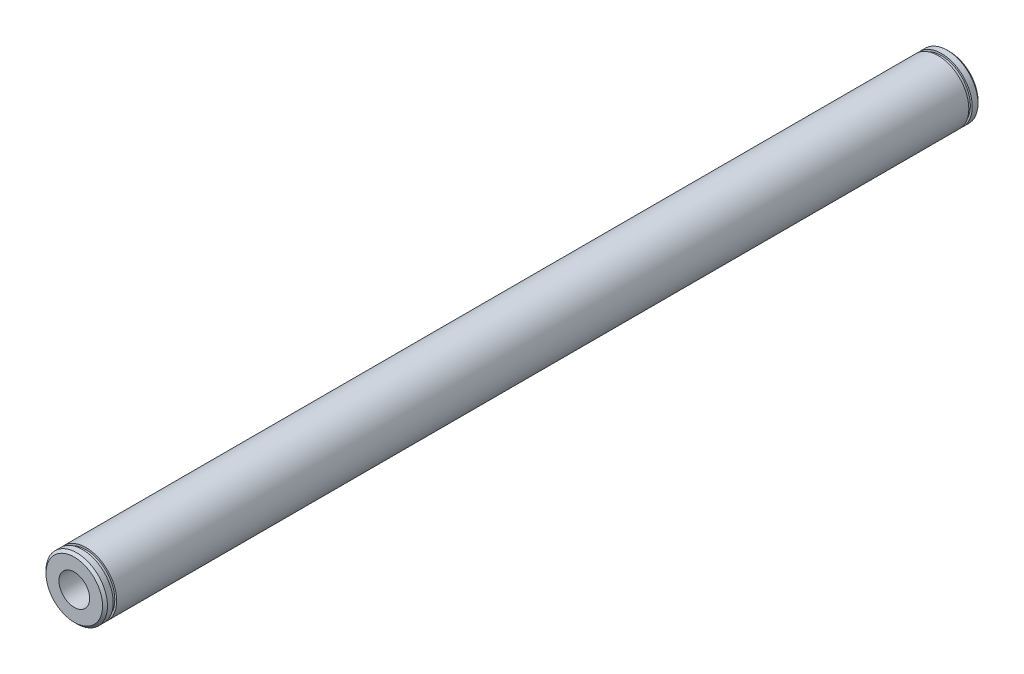
ISO-10303-21;
HEADER;
FILE_DESCRIPTION(('STEP AP214'),'2;1');
FILE_NAME('part.step','',(''),(''),'','','');
FILE_SCHEMA(('AUTOMOTIVE_DESIGN { 1 0 10303 214 1 1 1 1 }'));
ENDSEC;
DATA;
#1=APPLICATION_CONTEXT('core data for automotive mechanical design processes');
#2=APPLICATION_PROTOCOL_DEFINITION('international standard','automotive_design',2000,#1);
#3=PRODUCT_CONTEXT('',#1,'mechanical');
#4=PRODUCT('Part','Part','',(#3));
#5=PRODUCT_RELATED_PRODUCT_CATEGORY('part','',(#4));
#6=PRODUCT_DEFINITION_FORMATION('','',#4);
#7=PRODUCT_DEFINITION_CONTEXT('part definition',#1,'design');
#8=PRODUCT_DEFINITION('design','',#6,#7);
#9=PRODUCT_DEFINITION_SHAPE('','',#8);
#10=(LENGTH_UNIT() NAMED_UNIT(*) SI_UNIT(.MILLI.,.METRE.));
#11=(NAMED_UNIT(*) PLANE_ANGLE_UNIT() SI_UNIT($,.RADIAN.));
#12=(NAMED_UNIT(*) SI_UNIT($,.STERADIAN.) SOLID_ANGLE_UNIT());
#13=UNCERTAINTY_MEASURE_WITH_UNIT(LENGTH_MEASURE(1.E-05),#10,'distance_accuracy_value','');
#14=(GEOMETRIC_REPRESENTATION_CONTEXT(3) GLOBAL_UNCERTAINTY_ASSIGNED_CONTEXT((#13)) GLOBAL_UNIT_ASSIGNED_CONTEXT((#10,
#11,#12)) REPRESENTATION_CONTEXT('',''));
#15=CARTESIAN_POINT('',(0.,0.,0.));
#16=DIRECTION('',(0.,0.,1.));
#17=DIRECTION('',(1.,0.,0.));
#18=AXIS2_PLACEMENT_3D('',#15,#16,#17);
#19=CARTESIAN_POINT('',(0.,0.,131.953));
#20=DIRECTION('',(0.,0.,1.));
#21=DIRECTION('',(1.,0.,0.));
#22=AXIS2_PLACEMENT_3D('',#19,#20,#21);
#23=PLANE('',#22);
#24=CARTESIAN_POINT('',(0.,0.,131.953));
#25=DIRECTION('',(0.,0.,1.));
#26=DIRECTION('',(1.,0.,0.));
#27=AXIS2_PLACEMENT_3D('',#24,#25,#26);
#28=CIRCLE('',#27,9.525);
#29=CARTESIAN_POINT('',(9.525,0.,131.953));
#30=VERTEX_POINT('',#29);
#31=EDGE_CURVE('E51',#30,#30,#28,.T.);
#32=ORIENTED_EDGE('',*,*,#31,.T.);
#33=EDGE_LOOP('',(#32));
#34=FACE_BOUND('',#33,.T.);
#35=CARTESIAN_POINT('',(0.,0.,131.953));
#36=DIRECTION('',(0.,0.,1.));
#37=DIRECTION('',(1.,0.,0.));
#38=AXIS2_PLACEMENT_3D('',#35,#36,#37);
#39=CIRCLE('',#38,8.9408);
#40=CARTESIAN_POINT('',(8.9408,0.,131.953));
#41=VERTEX_POINT('',#40);
#42=EDGE_CURVE('E58',#41,#41,#39,.T.);
#43=ORIENTED_EDGE('',*,*,#42,.F.);
#44=EDGE_LOOP('',(#43));
#45=FACE_BOUND('',#44,.T.);
#46=ADVANCED_FACE('F31',(#34,#45),#23,.T.);
#47=CARTESIAN_POINT('',(0.,0.,-131.953));
#48=DIRECTION('',(0.,0.,1.));
#49=DIRECTION('',(1.,0.,0.));
#50=AXIS2_PLACEMENT_3D('',#47,#48,#49);
#51=PLANE('',#50);
#52=CARTESIAN_POINT('',(0.,0.,-131.953));
#53=DIRECTION('',(0.,0.,1.));
#54=DIRECTION('',(1.,0.,0.));
#55=AXIS2_PLACEMENT_3D('',#52,#53,#54);
#56=CIRCLE('',#55,8.9408);
#57=CARTESIAN_POINT('',(8.9408,0.,-131.953));
#58=VERTEX_POINT('',#57);
#59=EDGE_CURVE('E69',#58,#58,#56,.T.);
#60=ORIENTED_EDGE('',*,*,#59,.T.);
#61=EDGE_LOOP('',(#60));
#62=FACE_BOUND('',#61,.T.);
#63=CARTESIAN_POINT('',(0.,0.,-131.953));
#64=DIRECTION('',(0.,0.,1.));
#65=DIRECTION('',(1.,0.,0.));
#66=AXIS2_PLACEMENT_3D('',#63,#64,#65);
#67=CIRCLE('',#66,9.525);
#68=CARTESIAN_POINT('',(9.525,0.,-131.953));
#69=VERTEX_POINT('',#68);
#70=EDGE_CURVE('E52',#69,#69,#67,.T.);
#71=ORIENTED_EDGE('',*,*,#70,.F.);
#72=EDGE_LOOP('',(#71));
#73=FACE_BOUND('',#72,.T.);
#74=ADVANCED_FACE('F97',(#62,#73),#51,.F.);
#75=CARTESIAN_POINT('',(0.,0.,131.953));
#76=DIRECTION('',(0.,0.,-1.));
#77=DIRECTION('',(-1.,0.,0.));
#78=AXIS2_PLACEMENT_3D('',#75,#76,#77);
#79=CYLINDRICAL_SURFACE('',#78,9.525);
#80=ORIENTED_EDGE('',*,*,#31,.F.);
#81=EDGE_LOOP('',(#80));
#82=FACE_BOUND('',#81,.T.);
#83=ORIENTED_EDGE('',*,*,#70,.T.);
#84=EDGE_LOOP('',(#83));
#85=FACE_BOUND('',#84,.T.);
#86=ADVANCED_FACE('F87',(#82,#85),#79,.T.);
#87=CARTESIAN_POINT('',(0.,0.,131.953));
#88=DIRECTION('',(0.,0.,-1.));
#89=DIRECTION('',(-1.,0.,0.));
#90=AXIS2_PLACEMENT_3D('',#87,#88,#89);
#91=CYLINDRICAL_SURFACE('',#90,4.7498);
#92=CARTESIAN_POINT('',(0.,0.,135.5598));
#93=DIRECTION('',(0.,0.,1.));
#94=DIRECTION('',(1.,0.,0.));
#95=AXIS2_PLACEMENT_3D('',#92,#93,#94);
#96=CIRCLE('',#95,4.7498);
#97=CARTESIAN_POINT('',(4.7498,0.,135.5598));
#98=VERTEX_POINT('',#97);
#99=EDGE_CURVE('E66',#98,#98,#96,.T.);
#100=ORIENTED_EDGE('',*,*,#99,.T.);
#101=EDGE_LOOP('',(#100));
#102=FACE_BOUND('',#101,.T.);
#103=CARTESIAN_POINT('',(0.,0.,-135.5598));
#104=DIRECTION('',(0.,0.,1.));
#105=DIRECTION('',(1.,0.,0.));
#106=AXIS2_PLACEMENT_3D('',#103,#104,#105);
#107=CIRCLE('',#106,4.7498);
#108=CARTESIAN_POINT('',(4.7498,0.,-135.5598));
#109=VERTEX_POINT('',#108);
#110=EDGE_CURVE('E78',#109,#109,#107,.T.);
#111=ORIENTED_EDGE('',*,*,#110,.F.);
#112=EDGE_LOOP('',(#111));
#113=FACE_BOUND('',#112,.T.);
#114=ADVANCED_FACE('F84',(#102,#113),#91,.F.);
#115=CARTESIAN_POINT('',(0.,0.,133.0198));
#116=DIRECTION('',(0.,0.,-1.));
#117=DIRECTION('',(-1.,0.,0.));
#118=AXIS2_PLACEMENT_3D('',#115,#116,#117);
#119=CYLINDRICAL_SURFACE('',#118,8.9408);
#120=CARTESIAN_POINT('',(0.,0.,133.0198));
#121=DIRECTION('',(0.,0.,1.));
#122=DIRECTION('',(1.,0.,0.));
#123=AXIS2_PLACEMENT_3D('',#120,#121,#122);
#124=CIRCLE('',#123,8.9408);
#125=CARTESIAN_POINT('',(8.9408,0.,133.0198));
#126=VERTEX_POINT('',#125);
#127=EDGE_CURVE('E55',#126,#126,#124,.T.);
#128=ORIENTED_EDGE('',*,*,#127,.F.);
#129=EDGE_LOOP('',(#128));
#130=FACE_BOUND('',#129,.T.);
#131=ORIENTED_EDGE('',*,*,#42,.T.);
#132=EDGE_LOOP('',(#131));
#133=FACE_BOUND('',#132,.T.);
#134=ADVANCED_FACE('F86',(#130,#133),#119,.T.);
#135=CARTESIAN_POINT('',(0.,0.,133.0198));
#136=DIRECTION('',(0.,0.,1.));
#137=DIRECTION('',(1.,0.,0.));
#138=AXIS2_PLACEMENT_3D('',#135,#136,#137);
#139=PLANE('',#138);
#140=CARTESIAN_POINT('',(0.,0.,133.0198));
#141=DIRECTION('',(0.,0.,1.));
#142=DIRECTION('',(1.,0.,0.));
#143=AXIS2_PLACEMENT_3D('',#140,#141,#142);
#144=CIRCLE('',#143,9.525);
#145=CARTESIAN_POINT('',(9.525,0.,133.0198));
#146=VERTEX_POINT('',#145);
#147=EDGE_CURVE('E61',#146,#146,#144,.T.);
#148=ORIENTED_EDGE('',*,*,#147,.F.);
#149=EDGE_LOOP('',(#148));
#150=FACE_BOUND('',#149,.T.);
#151=ORIENTED_EDGE('',*,*,#127,.T.);
#152=EDGE_LOOP('',(#151));
#153=FACE_BOUND('',#152,.T.);
#154=ADVANCED_FACE('F94',(#150,#153),#139,.F.);
#155=CARTESIAN_POINT('',(0.,0.,135.5598));
#156=DIRECTION('',(0.,0.,1.));
#157=DIRECTION('',(1.,0.,0.));
#158=AXIS2_PLACEMENT_3D('',#155,#156,#157);
#159=PLANE('',#158);
#160=CARTESIAN_POINT('',(0.,0.,135.5598));
#161=DIRECTION('',(0.,0.,1.));
#162=DIRECTION('',(1.,0.,0.));
#163=AXIS2_PLACEMENT_3D('',#160,#161,#162);
#164=CIRCLE('',#163,8.76300000000002);
#165=CARTESIAN_POINT('',(-8.76300000000004,0.,135.5598));
#166=VERTEX_POINT('',#165);
#167=EDGE_CURVE('E46',#166,#166,#164,.T.);
#168=ORIENTED_EDGE('',*,*,#167,.T.);
#169=EDGE_LOOP('',(#168));
#170=FACE_BOUND('',#169,.T.);
#171=ORIENTED_EDGE('',*,*,#99,.F.);
#172=EDGE_LOOP('',(#171));
#173=FACE_BOUND('',#172,.T.);
#174=ADVANCED_FACE('F121',(#170,#173),#159,.T.);
#175=CARTESIAN_POINT('',(0.,0.,135.5598));
#176=DIRECTION('',(0.,0.,-1.));
#177=DIRECTION('',(-1.,0.,0.));
#178=AXIS2_PLACEMENT_3D('',#175,#176,#177);
#179=CYLINDRICAL_SURFACE('',#178,9.525);
#180=CARTESIAN_POINT('',(0.,0.,134.7978));
#181=DIRECTION('',(0.,0.,1.));
#182=DIRECTION('',(1.,0.,0.));
#183=AXIS2_PLACEMENT_3D('',#180,#181,#182);
#184=CIRCLE('',#183,9.525);
#185=CARTESIAN_POINT('',(-9.52500000000002,0.,134.7978));
#186=VERTEX_POINT('',#185);
#187=EDGE_CURVE('E42',#186,#186,#184,.F.);
#188=ORIENTED_EDGE('',*,*,#187,.T.);
#189=EDGE_LOOP('',(#188));
#190=FACE_BOUND('',#189,.T.);
#191=ORIENTED_EDGE('',*,*,#147,.T.);
#192=EDGE_LOOP('',(#191));
#193=FACE_BOUND('',#192,.T.);
#194=ADVANCED_FACE('F112',(#190,#193),#179,.T.);
#195=CARTESIAN_POINT('',(0.,0.,135.5598));
#196=DIRECTION('',(0.,0.,-1.));
#197=DIRECTION('',(-1.,0.,0.));
#198=AXIS2_PLACEMENT_3D('',#195,#196,#197);
#199=CONICAL_SURFACE('',#198,8.76300000000002,0.785398163397428);
#200=CARTESIAN_POINT('',(-9.52500000000002,0.,134.7978));
#201=CARTESIAN_POINT('',(-9.51706250000002,0.,134.8057375));
#202=CARTESIAN_POINT('',(-9.50912500000002,0.,134.813675));
#203=CARTESIAN_POINT('',(-9.49325000000002,0.,134.82955));
#204=CARTESIAN_POINT('',(-9.48531250000002,0.,134.8374875));
#205=CARTESIAN_POINT('',(-9.46943750000002,0.,134.8533625));
#206=CARTESIAN_POINT('',(-9.46150000000002,0.,134.8613));
#207=CARTESIAN_POINT('',(-9.44562500000002,0.,134.877175));
#208=CARTESIAN_POINT('',(-9.43768750000002,0.,134.8851125));
#209=CARTESIAN_POINT('',(-9.42181250000002,0.,134.9009875));
#210=CARTESIAN_POINT('',(-9.41387500000002,0.,134.908925));
#211=CARTESIAN_POINT('',(-9.39800000000002,0.,134.9248));
#212=CARTESIAN_POINT('',(-9.39006250000002,0.,134.9327375));
#213=CARTESIAN_POINT('',(-9.37418750000002,0.,134.9486125));
#214=CARTESIAN_POINT('',(-9.36625000000002,0.,134.95655));
#215=CARTESIAN_POINT('',(-9.35037500000002,0.,134.972425));
#216=CARTESIAN_POINT('',(-9.34243750000002,0.,134.9803625));
#217=CARTESIAN_POINT('',(-9.32656250000002,0.,134.9962375));
#218=CARTESIAN_POINT('',(-9.31862500000002,0.,135.004175));
#219=CARTESIAN_POINT('',(-9.30275000000002,0.,135.02005));
#220=CARTESIAN_POINT('',(-9.29481250000002,0.,135.0279875));
#221=CARTESIAN_POINT('',(-9.27893750000002,0.,135.0438625));
#222=CARTESIAN_POINT('',(-9.27100000000002,0.,135.0518));
#223=CARTESIAN_POINT('',(-9.25512500000003,0.,135.067675));
#224=CARTESIAN_POINT('',(-9.24718750000002,0.,135.0756125));
#225=CARTESIAN_POINT('',(-9.23131250000002,0.,135.0914875));
#226=CARTESIAN_POINT('',(-9.22337500000002,0.,135.099425));
#227=CARTESIAN_POINT('',(-9.20750000000002,0.,135.1153));
#228=CARTESIAN_POINT('',(-9.19956250000002,0.,135.1232375));
#229=CARTESIAN_POINT('',(-9.18368750000002,0.,135.1391125));
#230=CARTESIAN_POINT('',(-9.17575000000002,0.,135.14705));
#231=CARTESIAN_POINT('',(-9.15987500000003,0.,135.162925));
#232=CARTESIAN_POINT('',(-9.15193750000002,0.,135.1708625));
#233=CARTESIAN_POINT('',(-9.13606250000003,0.,135.1867375));
#234=CARTESIAN_POINT('',(-9.12812500000003,0.,135.194675));
#235=CARTESIAN_POINT('',(-9.11225000000003,0.,135.21055));
#236=CARTESIAN_POINT('',(-9.10431250000003,0.,135.2184875));
#237=CARTESIAN_POINT('',(-9.08843750000003,0.,135.2343625));
#238=CARTESIAN_POINT('',(-9.08050000000003,0.,135.2423));
#239=CARTESIAN_POINT('',(-9.06462500000003,0.,135.258175));
#240=CARTESIAN_POINT('',(-9.05668750000003,0.,135.2661125));
#241=CARTESIAN_POINT('',(-9.04081250000003,0.,135.2819875));
#242=CARTESIAN_POINT('',(-9.03287500000003,0.,135.289925));
#243=CARTESIAN_POINT('',(-9.01700000000003,0.,135.3058));
#244=CARTESIAN_POINT('',(-9.00906250000003,0.,135.3137375));
#245=CARTESIAN_POINT('',(-8.99318750000003,0.,135.3296125));
#246=CARTESIAN_POINT('',(-8.98525000000003,0.,135.33755));
#247=CARTESIAN_POINT('',(-8.96937500000003,0.,135.353425));
#248=CARTESIAN_POINT('',(-8.96143750000003,0.,135.3613625));
#249=CARTESIAN_POINT('',(-8.94556250000003,0.,135.3772375));
#250=CARTESIAN_POINT('',(-8.93762500000003,0.,135.385175));
#251=CARTESIAN_POINT('',(-8.92175000000003,0.,135.40105));
#252=CARTESIAN_POINT('',(-8.91381250000003,0.,135.4089875));
#253=CARTESIAN_POINT('',(-8.89793750000003,0.,135.4248625));
#254=CARTESIAN_POINT('',(-8.89000000000003,0.,135.4328));
#255=CARTESIAN_POINT('',(-8.87412500000003,0.,135.448675));
#256=CARTESIAN_POINT('',(-8.86618750000003,0.,135.4566125));
#257=CARTESIAN_POINT('',(-8.85031250000003,0.,135.4724875));
#258=CARTESIAN_POINT('',(-8.84237500000003,0.,135.480425));
#259=CARTESIAN_POINT('',(-8.82650000000003,0.,135.4963));
#260=CARTESIAN_POINT('',(-8.81856250000003,0.,135.5042375));
#261=CARTESIAN_POINT('',(-8.80268750000003,0.,135.5201125));
#262=CARTESIAN_POINT('',(-8.79475000000003,0.,135.52805));
#263=CARTESIAN_POINT('',(-8.77887500000003,0.,135.543925));
#264=CARTESIAN_POINT('',(-8.77093750000003,0.,135.5518625));
#265=CARTESIAN_POINT('',(-8.76300000000004,0.,135.5598));
#266=B_SPLINE_CURVE_WITH_KNOTS('',3,(#200,#201,#202,#203,#204,#205,#206,#207,#208,#209,#210,
#211,#212,#213,#214,#215,#216,#217,#218,#219,#220,#221,#222,#223,#224,#225,#226,#227,#228,#229,
#230,#231,#232,#233,#234,#235,#236,#237,#238,#239,#240,#241,#242,#243,#244,#245,#246,#247,#248,
#249,#250,#251,#252,#253,#254,#255,#256,#257,#258,#259,#260,#261,#262,#263,#264,#265),
.UNSPECIFIED.,.F.,.F.,(4,2,2,2,2,2,2,2,2,2,2,2,2,2,2,2,2,2,2,2,2,2,2,2,2,2,2,2,2,2,2,2,4),(0.,
0.0336759604540074,0.0673519209080149,0.101027881362022,0.13470384181603,0.168379802270037,
0.202055762724045,0.235731723178052,0.269407683632059,0.303083644086066,0.336759604540073,
0.3704355649941,0.404111525448108,0.437787485902115,0.471463446356123,0.50513940681013,
0.538815367264137,0.572491327718145,0.606167288172152,0.639843248626159,0.673519209080167,
0.707195169534174,0.740871129988201,0.774547090442209,0.808223050896215,0.841899011350222,
0.87557497180423,0.909250932258237,0.942926892712244,0.976602853166252,1.01027881362026,
1.04395477407427,1.07763073452829),.UNSPECIFIED.);
#267=EDGE_CURVE('BSEAM109',#186,#166,#266,.T.);
#268=ORIENTED_EDGE('',*,*,#187,.F.);
#269=ORIENTED_EDGE('',*,*,#167,.F.);
#270=ORIENTED_EDGE('',*,*,#267,.T.);
#271=ORIENTED_EDGE('',*,*,#267,.F.);
#272=EDGE_LOOP('',(#268,#270,#269,#271));
#273=FACE_BOUND('',#272,.T.);
#274=ADVANCED_FACE('F109',(#273),#199,.T.);
#275=CARTESIAN_POINT('',(0.,0.,-133.0198));
#276=DIRECTION('',(0.,0.,1.));
#277=DIRECTION('',(1.,0.,0.));
#278=AXIS2_PLACEMENT_3D('',#275,#276,#277);
#279=CYLINDRICAL_SURFACE('',#278,8.9408);
#280=CARTESIAN_POINT('',(0.,0.,-133.0198));
#281=DIRECTION('',(0.,0.,-1.));
#282=DIRECTION('',(-1.,0.,0.));
#283=AXIS2_PLACEMENT_3D('',#280,#281,#282);
#284=CIRCLE('',#283,8.9408);
#285=CARTESIAN_POINT('',(-8.9408,0.,-133.0198));
#286=VERTEX_POINT('',#285);
#287=EDGE_CURVE('E72',#286,#286,#284,.F.);
#288=ORIENTED_EDGE('',*,*,#287,.T.);
#289=EDGE_LOOP('',(#288));
#290=FACE_BOUND('',#289,.T.);
#291=ORIENTED_EDGE('',*,*,#59,.F.);
#292=EDGE_LOOP('',(#291));
#293=FACE_BOUND('',#292,.T.);
#294=ADVANCED_FACE('F111',(#290,#293),#279,.T.);
#295=CARTESIAN_POINT('',(0.,0.,-135.5598));
#296=DIRECTION('',(0.,0.,1.));
#297=DIRECTION('',(1.,0.,0.));
#298=AXIS2_PLACEMENT_3D('',#295,#296,#297);
#299=CYLINDRICAL_SURFACE('',#298,9.525);
#300=CARTESIAN_POINT('',(0.,0.,-134.7978));
#301=DIRECTION('',(0.,0.,-1.));
#302=DIRECTION('',(-1.,0.,0.));
#303=AXIS2_PLACEMENT_3D('',#300,#301,#302);
#304=CIRCLE('',#303,9.525);
#305=CARTESIAN_POINT('',(9.52500000000002,0.,-134.7978));
#306=VERTEX_POINT('',#305);
#307=EDGE_CURVE('E38',#306,#306,#304,.F.);
#308=ORIENTED_EDGE('',*,*,#307,.T.);
#309=EDGE_LOOP('',(#308));
#310=FACE_BOUND('',#309,.T.);
#311=CARTESIAN_POINT('',(0.,0.,-133.0198));
#312=DIRECTION('',(0.,0.,1.));
#313=DIRECTION('',(1.,0.,0.));
#314=AXIS2_PLACEMENT_3D('',#311,#312,#313);
#315=CIRCLE('',#314,9.525);
#316=CARTESIAN_POINT('',(9.525,0.,-133.0198));
#317=VERTEX_POINT('',#316);
#318=EDGE_CURVE('E75',#317,#317,#315,.T.);
#319=ORIENTED_EDGE('',*,*,#318,.F.);
#320=EDGE_LOOP('',(#319));
#321=FACE_BOUND('',#320,.T.);
#322=ADVANCED_FACE('F118',(#310,#321),#299,.T.);
#323=CARTESIAN_POINT('',(0.,0.,-135.5598));
#324=DIRECTION('',(0.,0.,-1.));
#325=DIRECTION('',(1.,0.,0.));
#326=AXIS2_PLACEMENT_3D('',#323,#324,#325);
#327=PLANE('',#326);
#328=CARTESIAN_POINT('',(0.,0.,-135.5598));
#329=DIRECTION('',(0.,0.,-1.));
#330=DIRECTION('',(-1.,0.,0.));
#331=AXIS2_PLACEMENT_3D('',#328,#329,#330);
#332=CIRCLE('',#331,8.763);
#333=CARTESIAN_POINT('',(8.76300000000001,0.,-135.5598));
#334=VERTEX_POINT('',#333);
#335=EDGE_CURVE('E10',#334,#334,#332,.T.);
#336=ORIENTED_EDGE('',*,*,#335,.T.);
#337=EDGE_LOOP('',(#336));
#338=FACE_BOUND('',#337,.T.);
#339=ORIENTED_EDGE('',*,*,#110,.T.);
#340=EDGE_LOOP('',(#339));
#341=FACE_BOUND('',#340,.T.);
#342=ADVANCED_FACE('F82',(#338,#341),#327,.T.);
#343=CARTESIAN_POINT('',(0.,0.,-133.0198));
#344=DIRECTION('',(0.,0.,-1.));
#345=DIRECTION('',(1.,0.,0.));
#346=AXIS2_PLACEMENT_3D('',#343,#344,#345);
#347=PLANE('',#346);
#348=ORIENTED_EDGE('',*,*,#287,.F.);
#349=EDGE_LOOP('',(#348));
#350=FACE_BOUND('',#349,.T.);
#351=ORIENTED_EDGE('',*,*,#318,.T.);
#352=EDGE_LOOP('',(#351));
#353=FACE_BOUND('',#352,.T.);
#354=ADVANCED_FACE('F140',(#350,#353),#347,.F.);
#355=CARTESIAN_POINT('',(0.,0.,-134.7978));
#356=DIRECTION('',(0.,0.,1.));
#357=DIRECTION('',(1.,0.,0.));
#358=AXIS2_PLACEMENT_3D('',#355,#356,#357);
#359=CONICAL_SURFACE('',#358,9.525,0.785398163397444);
#360=CARTESIAN_POINT('',(8.76300000000001,0.,-135.5598));
#361=CARTESIAN_POINT('',(8.77093750000001,0.,-135.5518625));
#362=CARTESIAN_POINT('',(8.77887500000001,0.,-135.543925));
#363=CARTESIAN_POINT('',(8.79475000000001,0.,-135.52805));
#364=CARTESIAN_POINT('',(8.80268750000001,0.,-135.5201125));
#365=CARTESIAN_POINT('',(8.81856250000001,0.,-135.5042375));
#366=CARTESIAN_POINT('',(8.82650000000001,0.,-135.4963));
#367=CARTESIAN_POINT('',(8.84237500000001,0.,-135.480425));
#368=CARTESIAN_POINT('',(8.85031250000001,0.,-135.4724875));
#369=CARTESIAN_POINT('',(8.86618750000001,0.,-135.4566125));
#370=CARTESIAN_POINT('',(8.87412500000001,0.,-135.448675));
#371=CARTESIAN_POINT('',(8.89000000000001,0.,-135.4328));
#372=CARTESIAN_POINT('',(8.89793750000001,0.,-135.4248625));
#373=CARTESIAN_POINT('',(8.91381250000001,0.,-135.4089875));
#374=CARTESIAN_POINT('',(8.92175000000001,0.,-135.40105));
#375=CARTESIAN_POINT('',(8.93762500000001,0.,-135.385175));
#376=CARTESIAN_POINT('',(8.94556250000001,0.,-135.3772375));
#377=CARTESIAN_POINT('',(8.96143750000001,0.,-135.3613625));
#378=CARTESIAN_POINT('',(8.96937500000001,0.,-135.353425));
#379=CARTESIAN_POINT('',(8.98525000000001,0.,-135.33755));
#380=CARTESIAN_POINT('',(8.99318750000002,0.,-135.3296125));
#381=CARTESIAN_POINT('',(9.00906250000001,0.,-135.3137375));
#382=CARTESIAN_POINT('',(9.01700000000001,0.,-135.3058));
#383=CARTESIAN_POINT('',(9.03287500000001,0.,-135.289925));
#384=CARTESIAN_POINT('',(9.04081250000001,0.,-135.2819875));
#385=CARTESIAN_POINT('',(9.05668750000001,0.,-135.2661125));
#386=CARTESIAN_POINT('',(9.06462500000001,0.,-135.258175));
#387=CARTESIAN_POINT('',(9.08050000000001,0.,-135.2423));
#388=CARTESIAN_POINT('',(9.08843750000001,0.,-135.2343625));
#389=CARTESIAN_POINT('',(9.10431250000001,0.,-135.2184875));
#390=CARTESIAN_POINT('',(9.11225000000001,0.,-135.21055));
#391=CARTESIAN_POINT('',(9.12812500000001,0.,-135.194675));
#392=CARTESIAN_POINT('',(9.13606250000001,0.,-135.1867375));
#393=CARTESIAN_POINT('',(9.15193750000001,0.,-135.1708625));
#394=CARTESIAN_POINT('',(9.15987500000001,0.,-135.162925));
#395=CARTESIAN_POINT('',(9.17575000000001,0.,-135.14705));
#396=CARTESIAN_POINT('',(9.18368750000001,0.,-135.1391125));
#397=CARTESIAN_POINT('',(9.19956250000001,0.,-135.1232375));
#398=CARTESIAN_POINT('',(9.20750000000001,0.,-135.1153));
#399=CARTESIAN_POINT('',(9.22337500000001,0.,-135.099425));
#400=CARTESIAN_POINT('',(9.23131250000001,0.,-135.0914875));
#401=CARTESIAN_POINT('',(9.24718750000001,0.,-135.0756125));
#402=CARTESIAN_POINT('',(9.25512500000002,0.,-135.067675));
#403=CARTESIAN_POINT('',(9.27100000000002,0.,-135.0518));
#404=CARTESIAN_POINT('',(9.27893750000001,0.,-135.0438625));
#405=CARTESIAN_POINT('',(9.29481250000001,0.,-135.0279875));
#406=CARTESIAN_POINT('',(9.30275000000001,0.,-135.02005));
#407=CARTESIAN_POINT('',(9.31862500000002,0.,-135.004175));
#408=CARTESIAN_POINT('',(9.32656250000002,0.,-134.9962375));
#409=CARTESIAN_POINT('',(9.34243750000001,0.,-134.9803625));
#410=CARTESIAN_POINT('',(9.35037500000002,0.,-134.972425));
#411=CARTESIAN_POINT('',(9.36625000000002,0.,-134.95655));
#412=CARTESIAN_POINT('',(9.37418750000001,0.,-134.9486125));
#413=CARTESIAN_POINT('',(9.39006250000002,0.,-134.9327375));
#414=CARTESIAN_POINT('',(9.39800000000002,0.,-134.9248));
#415=CARTESIAN_POINT('',(9.41387500000002,0.,-134.908925));
#416=CARTESIAN_POINT('',(9.42181250000002,0.,-134.9009875));
#417=CARTESIAN_POINT('',(9.43768750000002,0.,-134.8851125));
#418=CARTESIAN_POINT('',(9.44562500000001,0.,-134.877175));
#419=CARTESIAN_POINT('',(9.46150000000002,0.,-134.8613));
#420=CARTESIAN_POINT('',(9.46943750000002,0.,-134.8533625));
#421=CARTESIAN_POINT('',(9.48531250000002,0.,-134.8374875));
#422=CARTESIAN_POINT('',(9.49325000000002,0.,-134.82955));
#423=CARTESIAN_POINT('',(9.50912500000002,0.,-134.813675));
#424=CARTESIAN_POINT('',(9.51706250000002,0.,-134.8057375));
#425=CARTESIAN_POINT('',(9.52500000000002,0.,-134.7978));
#426=B_SPLINE_CURVE_WITH_KNOTS('',3,(#360,#361,#362,#363,#364,#365,#366,#367,#368,#369,#370,
#371,#372,#373,#374,#375,#376,#377,#378,#379,#380,#381,#382,#383,#384,#385,#386,#387,#388,#389,
#390,#391,#392,#393,#394,#395,#396,#397,#398,#399,#400,#401,#402,#403,#404,#405,#406,#407,#408,
#409,#410,#411,#412,#413,#414,#415,#416,#417,#418,#419,#420,#421,#422,#423,#424,#425),
.UNSPECIFIED.,.F.,.F.,(4,2,2,2,2,2,2,2,2,2,2,2,2,2,2,2,2,2,2,2,2,2,2,2,2,2,2,2,2,2,2,2,4),(0.,
0.0336759604540074,0.0673519209080161,0.101027881362024,0.134703841816032,0.16837980227004,
0.202055762724047,0.235731723178056,0.269407683632063,0.303083644086071,0.336759604540079,
0.370435564994106,0.404111525448114,0.437787485902122,0.47146344635613,0.505139406810138,
0.538815367264146,0.572491327718153,0.606167288172162,0.639843248626169,0.673519209080178,
0.707195169534185,0.740871129988212,0.774547090442221,0.808223050896228,0.841899011350236,
0.875574971804245,0.909250932258252,0.942926892712259,0.976602853166268,1.01027881362028,
1.04395477407428,1.07763073452829),.UNSPECIFIED.);
#427=EDGE_CURVE('BSEAM33',#334,#306,#426,.T.);
#428=ORIENTED_EDGE('',*,*,#335,.F.);
#429=ORIENTED_EDGE('',*,*,#307,.F.);
#430=ORIENTED_EDGE('',*,*,#427,.T.);
#431=ORIENTED_EDGE('',*,*,#427,.F.);
#432=EDGE_LOOP('',(#428,#430,#429,#431));
#433=FACE_BOUND('',#432,.T.);
#434=ADVANCED_FACE('F33',(#433),#359,.T.);
#435=CLOSED_SHELL('',(#46,#74,#86,#114,#134,#154,#174,#194,#274,#294,#322,#342,#354,#434));
#436=MANIFOLD_SOLID_BREP('B2',#435);
#437=ADVANCED_BREP_SHAPE_REPRESENTATION('',(#18,#436),#14);
#438=SHAPE_DEFINITION_REPRESENTATION(#9,#437);
ENDSEC;
END-ISO-10303-21;
